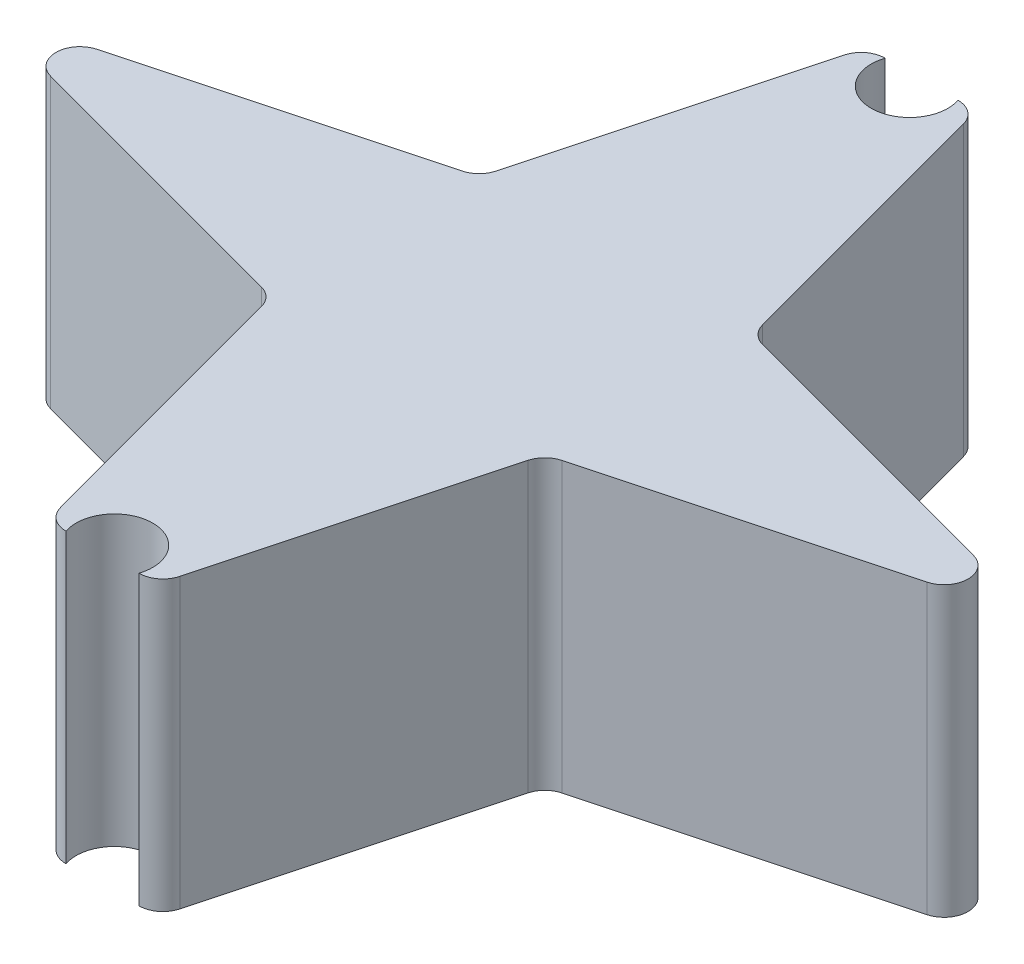
ISO-10303-21;
HEADER;
FILE_DESCRIPTION(('STEP AP214'),'2;1');
FILE_NAME('part.step','',(''),(''),'','','');
FILE_SCHEMA(('AUTOMOTIVE_DESIGN { 1 0 10303 214 1 1 1 1 }'));
ENDSEC;
DATA;
#1=APPLICATION_CONTEXT('core data for automotive mechanical design processes');
#2=APPLICATION_PROTOCOL_DEFINITION('international standard','automotive_design',2000,#1);
#3=PRODUCT_CONTEXT('',#1,'mechanical');
#4=PRODUCT('Part','Part','',(#3));
#5=PRODUCT_RELATED_PRODUCT_CATEGORY('part','',(#4));
#6=PRODUCT_DEFINITION_FORMATION('','',#4);
#7=PRODUCT_DEFINITION_CONTEXT('part definition',#1,'design');
#8=PRODUCT_DEFINITION('design','',#6,#7);
#9=PRODUCT_DEFINITION_SHAPE('','',#8);
#10=(LENGTH_UNIT() NAMED_UNIT(*) SI_UNIT(.MILLI.,.METRE.));
#11=(NAMED_UNIT(*) PLANE_ANGLE_UNIT() SI_UNIT($,.RADIAN.));
#12=(NAMED_UNIT(*) SI_UNIT($,.STERADIAN.) SOLID_ANGLE_UNIT());
#13=UNCERTAINTY_MEASURE_WITH_UNIT(LENGTH_MEASURE(1.E-05),#10,'distance_accuracy_value','');
#14=(GEOMETRIC_REPRESENTATION_CONTEXT(3) GLOBAL_UNCERTAINTY_ASSIGNED_CONTEXT((#13)) GLOBAL_UNIT_ASSIGNED_CONTEXT((#10,
#11,#12)) REPRESENTATION_CONTEXT('',''));
#15=CARTESIAN_POINT('',(0.,0.,0.));
#16=DIRECTION('',(0.,0.,1.));
#17=DIRECTION('',(1.,0.,0.));
#18=AXIS2_PLACEMENT_3D('',#15,#16,#17);
#19=CARTESIAN_POINT('',(18.,12.,0.));
#20=DIRECTION('',(0.,-1.,0.));
#21=DIRECTION('',(0.,0.,-1.));
#22=AXIS2_PLACEMENT_3D('',#19,#20,#21);
#23=CYLINDRICAL_SURFACE('',#22,1.);
#24=CARTESIAN_POINT('',(18.,0.,0.));
#25=DIRECTION('',(0.,1.,0.));
#26=DIRECTION('',(0.,0.,-1.));
#27=AXIS2_PLACEMENT_3D('',#24,#25,#26);
#28=CIRCLE('',#27,1.);
#29=CARTESIAN_POINT('',(18.2588190451025,0.,0.965925826289069));
#30=VERTEX_POINT('',#29);
#31=CARTESIAN_POINT('',(18.2588190451025,0.,-0.965925826289069));
#32=VERTEX_POINT('',#31);
#33=EDGE_CURVE('E200',#30,#32,#28,.T.);
#34=ORIENTED_EDGE('',*,*,#33,.T.);
#35=DIRECTION('',(0.,-1.,0.));
#36=VECTOR('',#35,1.);
#37=CARTESIAN_POINT('',(18.2588190451025,12.,-0.965925826289069));
#38=LINE('',#37,#36);
#39=CARTESIAN_POINT('',(18.2588190451025,12.,-0.965925826289069));
#40=VERTEX_POINT('',#39);
#41=EDGE_CURVE('E11',#40,#32,#38,.T.);
#42=ORIENTED_EDGE('',*,*,#41,.F.);
#43=CARTESIAN_POINT('',(18.,12.,0.));
#44=DIRECTION('',(0.,1.,0.));
#45=DIRECTION('',(0.,0.,-1.));
#46=AXIS2_PLACEMENT_3D('',#43,#44,#45);
#47=CIRCLE('',#46,1.);
#48=CARTESIAN_POINT('',(18.2588190451025,12.,0.965925826289069));
#49=VERTEX_POINT('',#48);
#50=EDGE_CURVE('E238',#49,#40,#47,.T.);
#51=ORIENTED_EDGE('',*,*,#50,.F.);
#52=DIRECTION('',(0.,-1.,0.));
#53=VECTOR('',#52,1.);
#54=CARTESIAN_POINT('',(18.2588190451025,12.,0.965925826289069));
#55=LINE('',#54,#53);
#56=EDGE_CURVE('E196',#49,#30,#55,.T.);
#57=ORIENTED_EDGE('',*,*,#56,.T.);
#58=EDGE_LOOP('',(#34,#42,#51,#57));
#59=FACE_BOUND('',#58,.T.);
#60=ADVANCED_FACE('F32',(#59),#23,.T.);
#61=CARTESIAN_POINT('',(6.25652833872589,12.,-4.18192992838626));
#62=DIRECTION('',(-0.258819045102521,0.,0.965925826289068));
#63=DIRECTION('',(0.965925826289068,0.,0.258819045102521));
#64=AXIS2_PLACEMENT_3D('',#61,#62,#63);
#65=PLANE('',#64);
#66=DIRECTION('',(-0.965925826289068,0.,-0.258819045102521));
#67=VECTOR('',#66,1.);
#68=CARTESIAN_POINT('',(6.25652833872589,0.,-4.18192992838626));
#69=LINE('',#68,#67);
#70=CARTESIAN_POINT('',(6.25652833872589,0.,-4.18192992838626));
#71=VERTEX_POINT('',#70);
#72=EDGE_CURVE('E203',#32,#71,#69,.T.);
#73=ORIENTED_EDGE('',*,*,#72,.T.);
#74=DIRECTION('',(0.,-1.,0.));
#75=VECTOR('',#74,1.);
#76=CARTESIAN_POINT('',(6.25652833872589,12.,-4.18192992838626));
#77=LINE('',#76,#75);
#78=CARTESIAN_POINT('',(6.25652833872589,12.,-4.18192992838626));
#79=VERTEX_POINT('',#78);
#80=EDGE_CURVE('E40',#79,#71,#77,.T.);
#81=ORIENTED_EDGE('',*,*,#80,.F.);
#82=DIRECTION('',(-0.965925826289068,0.,-0.258819045102521));
#83=VECTOR('',#82,1.);
#84=CARTESIAN_POINT('',(6.25652833872589,12.,-4.18192992838626));
#85=LINE('',#84,#83);
#86=EDGE_CURVE('E127',#40,#79,#85,.T.);
#87=ORIENTED_EDGE('',*,*,#86,.F.);
#88=ORIENTED_EDGE('',*,*,#41,.T.);
#89=EDGE_LOOP('',(#73,#81,#87,#88));
#90=FACE_BOUND('',#89,.T.);
#91=ADVANCED_FACE('F356',(#90),#65,.F.);
#92=CARTESIAN_POINT('',(6.51534738382841,12.,-5.14785575467533));
#93=DIRECTION('',(0.,-1.,0.));
#94=DIRECTION('',(0.,0.,-1.));
#95=AXIS2_PLACEMENT_3D('',#92,#93,#94);
#96=CYLINDRICAL_SURFACE('',#95,1.);
#97=CARTESIAN_POINT('',(6.51534738382841,0.,-5.14785575467533));
#98=DIRECTION('',(0.,-1.,0.));
#99=DIRECTION('',(0.,0.,1.));
#100=AXIS2_PLACEMENT_3D('',#97,#98,#99);
#101=CIRCLE('',#100,1.);
#102=CARTESIAN_POINT('',(5.54942155753934,0.,-4.88903670957281));
#103=VERTEX_POINT('',#102);
#104=EDGE_CURVE('E205',#71,#103,#101,.T.);
#105=ORIENTED_EDGE('',*,*,#104,.T.);
#106=DIRECTION('',(0.,-1.,0.));
#107=VECTOR('',#106,1.);
#108=CARTESIAN_POINT('',(5.54942155753934,12.,-4.88903670957281));
#109=LINE('',#108,#107);
#110=CARTESIAN_POINT('',(5.54942155753934,12.,-4.88903670957281));
#111=VERTEX_POINT('',#110);
#112=EDGE_CURVE('E281',#111,#103,#109,.T.);
#113=ORIENTED_EDGE('',*,*,#112,.F.);
#114=CARTESIAN_POINT('',(6.51534738382841,12.,-5.14785575467533));
#115=DIRECTION('',(0.,-1.,0.));
#116=DIRECTION('',(0.,0.,1.));
#117=AXIS2_PLACEMENT_3D('',#114,#115,#116);
#118=CIRCLE('',#117,1.);
#119=EDGE_CURVE('E289',#79,#111,#118,.T.);
#120=ORIENTED_EDGE('',*,*,#119,.F.);
#121=ORIENTED_EDGE('',*,*,#80,.T.);
#122=EDGE_LOOP('',(#105,#113,#120,#121));
#123=FACE_BOUND('',#122,.T.);
#124=ADVANCED_FACE('F287',(#123),#96,.F.);
#125=CARTESIAN_POINT('',(2.48579424164614,12.,-16.3226495079421));
#126=DIRECTION('',(-0.965925826289068,0.,0.258819045102522));
#127=DIRECTION('',(0.258819045102522,0.,0.965925826289068));
#128=AXIS2_PLACEMENT_3D('',#125,#126,#127);
#129=PLANE('',#128);
#130=DIRECTION('',(-0.258819045102522,0.,-0.965925826289068));
#131=VECTOR('',#130,1.);
#132=CARTESIAN_POINT('',(2.48579424164614,0.,-16.3226495079421));
#133=LINE('',#132,#131);
#134=CARTESIAN_POINT('',(2.48579424164614,0.,-16.3226495079421));
#135=VERTEX_POINT('',#134);
#136=EDGE_CURVE('E207',#103,#135,#133,.T.);
#137=ORIENTED_EDGE('',*,*,#136,.T.);
#138=DIRECTION('',(0.,-1.,0.));
#139=VECTOR('',#138,1.);
#140=CARTESIAN_POINT('',(2.48579424164614,12.,-16.3226495079421));
#141=LINE('',#140,#139);
#142=CARTESIAN_POINT('',(2.48579424164614,12.,-16.3226495079421));
#143=VERTEX_POINT('',#142);
#144=EDGE_CURVE('E278',#143,#135,#141,.T.);
#145=ORIENTED_EDGE('',*,*,#144,.F.);
#146=DIRECTION('',(-0.258819045102522,0.,-0.965925826289068));
#147=VECTOR('',#146,1.);
#148=CARTESIAN_POINT('',(2.48579424164614,12.,-16.3226495079421));
#149=LINE('',#148,#147);
#150=EDGE_CURVE('E307',#111,#143,#149,.T.);
#151=ORIENTED_EDGE('',*,*,#150,.F.);
#152=ORIENTED_EDGE('',*,*,#112,.T.);
#153=EDGE_LOOP('',(#137,#145,#151,#152));
#154=FACE_BOUND('',#153,.T.);
#155=ADVANCED_FACE('F298',(#154),#129,.F.);
#156=CARTESIAN_POINT('',(1.51986841535707,12.,-16.0638304628395));
#157=DIRECTION('',(0.,-1.,0.));
#158=DIRECTION('',(0.,0.,-1.));
#159=AXIS2_PLACEMENT_3D('',#156,#157,#158);
#160=CYLINDRICAL_SURFACE('',#159,1.);
#161=CARTESIAN_POINT('',(1.51986841535707,0.,-16.0638304628395));
#162=DIRECTION('',(0.,1.,0.));
#163=DIRECTION('',(0.,0.,1.));
#164=AXIS2_PLACEMENT_3D('',#161,#162,#163);
#165=CIRCLE('',#164,1.);
#166=CARTESIAN_POINT('',(1.51986841535707,0.,-17.0638304628396));
#167=VERTEX_POINT('',#166);
#168=EDGE_CURVE('E209',#135,#167,#165,.T.);
#169=ORIENTED_EDGE('',*,*,#168,.T.);
#170=DIRECTION('',(0.,-1.,0.));
#171=VECTOR('',#170,1.);
#172=CARTESIAN_POINT('',(1.51986841535707,12.,-17.0638304628396));
#173=LINE('',#172,#171);
#174=CARTESIAN_POINT('',(1.51986841535707,12.,-17.0638304628396));
#175=VERTEX_POINT('',#174);
#176=EDGE_CURVE('E275',#175,#167,#173,.T.);
#177=ORIENTED_EDGE('',*,*,#176,.F.);
#178=CARTESIAN_POINT('',(1.51986841535707,12.,-16.0638304628395));
#179=DIRECTION('',(0.,1.,0.));
#180=DIRECTION('',(0.,0.,1.));
#181=AXIS2_PLACEMENT_3D('',#178,#179,#180);
#182=CIRCLE('',#181,1.);
#183=EDGE_CURVE('E304',#143,#175,#182,.T.);
#184=ORIENTED_EDGE('',*,*,#183,.F.);
#185=ORIENTED_EDGE('',*,*,#144,.T.);
#186=EDGE_LOOP('',(#169,#177,#184,#185));
#187=FACE_BOUND('',#186,.T.);
#188=ADVANCED_FACE('F302',(#187),#160,.T.);
#189=CARTESIAN_POINT('',(0.,12.,-16.5638304628396));
#190=DIRECTION('',(0.,-1.,0.));
#191=DIRECTION('',(0.,0.,-1.));
#192=AXIS2_PLACEMENT_3D('',#189,#190,#191);
#193=CYLINDRICAL_SURFACE('',#192,1.60000000000001);
#194=CARTESIAN_POINT('',(0.,0.,-16.5638304628396));
#195=DIRECTION('',(0.,-1.,0.));
#196=DIRECTION('',(0.,0.,1.));
#197=AXIS2_PLACEMENT_3D('',#194,#195,#196);
#198=CIRCLE('',#197,1.60000000000001);
#199=CARTESIAN_POINT('',(-1.51986841535709,0.,-17.0638304628396));
#200=VERTEX_POINT('',#199);
#201=EDGE_CURVE('E211',#167,#200,#198,.T.);
#202=ORIENTED_EDGE('',*,*,#201,.T.);
#203=DIRECTION('',(0.,-1.,0.));
#204=VECTOR('',#203,1.);
#205=CARTESIAN_POINT('',(-1.51986841535709,12.,-17.0638304628396));
#206=LINE('',#205,#204);
#207=CARTESIAN_POINT('',(-1.51986841535709,12.,-17.0638304628396));
#208=VERTEX_POINT('',#207);
#209=EDGE_CURVE('E272',#208,#200,#206,.T.);
#210=ORIENTED_EDGE('',*,*,#209,.F.);
#211=CARTESIAN_POINT('',(0.,12.,-16.5638304628396));
#212=DIRECTION('',(0.,-1.,0.));
#213=DIRECTION('',(0.,0.,1.));
#214=AXIS2_PLACEMENT_3D('',#211,#212,#213);
#215=CIRCLE('',#214,1.60000000000001);
#216=EDGE_CURVE('E306',#175,#208,#215,.T.);
#217=ORIENTED_EDGE('',*,*,#216,.F.);
#218=ORIENTED_EDGE('',*,*,#176,.T.);
#219=EDGE_LOOP('',(#202,#210,#217,#218));
#220=FACE_BOUND('',#219,.T.);
#221=ADVANCED_FACE('F369',(#220),#193,.F.);
#222=CARTESIAN_POINT('',(-1.51986841535707,12.,-16.0638304628395));
#223=DIRECTION('',(0.,-1.,0.));
#224=DIRECTION('',(0.,0.,-1.));
#225=AXIS2_PLACEMENT_3D('',#222,#223,#224);
#226=CYLINDRICAL_SURFACE('',#225,1.);
#227=CARTESIAN_POINT('',(-1.51986841535707,0.,-16.0638304628395));
#228=DIRECTION('',(0.,1.,0.));
#229=DIRECTION('',(0.,0.,-1.));
#230=AXIS2_PLACEMENT_3D('',#227,#228,#229);
#231=CIRCLE('',#230,1.);
#232=CARTESIAN_POINT('',(-2.48579424164614,0.,-16.3226495079421));
#233=VERTEX_POINT('',#232);
#234=EDGE_CURVE('E213',#200,#233,#231,.T.);
#235=ORIENTED_EDGE('',*,*,#234,.T.);
#236=DIRECTION('',(0.,-1.,0.));
#237=VECTOR('',#236,1.);
#238=CARTESIAN_POINT('',(-2.48579424164614,12.,-16.3226495079421));
#239=LINE('',#238,#237);
#240=CARTESIAN_POINT('',(-2.48579424164614,12.,-16.3226495079421));
#241=VERTEX_POINT('',#240);
#242=EDGE_CURVE('E269',#241,#233,#239,.T.);
#243=ORIENTED_EDGE('',*,*,#242,.F.);
#244=CARTESIAN_POINT('',(-1.51986841535707,12.,-16.0638304628395));
#245=DIRECTION('',(0.,1.,0.));
#246=DIRECTION('',(0.,0.,-1.));
#247=AXIS2_PLACEMENT_3D('',#244,#245,#246);
#248=CIRCLE('',#247,1.);
#249=EDGE_CURVE('E309',#208,#241,#248,.T.);
#250=ORIENTED_EDGE('',*,*,#249,.F.);
#251=ORIENTED_EDGE('',*,*,#209,.T.);
#252=EDGE_LOOP('',(#235,#243,#250,#251));
#253=FACE_BOUND('',#252,.T.);
#254=ADVANCED_FACE('F372',(#253),#226,.T.);
#255=CARTESIAN_POINT('',(-2.48579424164614,12.,-16.3226495079421));
#256=DIRECTION('',(0.965925826289068,0.,0.258819045102521));
#257=DIRECTION('',(0.258819045102521,0.,-0.965925826289068));
#258=AXIS2_PLACEMENT_3D('',#255,#256,#257);
#259=PLANE('',#258);
#260=DIRECTION('',(-0.258819045102521,0.,0.965925826289068));
#261=VECTOR('',#260,1.);
#262=CARTESIAN_POINT('',(-2.48579424164614,0.,-16.3226495079421));
#263=LINE('',#262,#261);
#264=CARTESIAN_POINT('',(-5.54942155753934,0.,-4.88903670957281));
#265=VERTEX_POINT('',#264);
#266=EDGE_CURVE('E215',#233,#265,#263,.T.);
#267=ORIENTED_EDGE('',*,*,#266,.T.);
#268=DIRECTION('',(0.,-1.,0.));
#269=VECTOR('',#268,1.);
#270=CARTESIAN_POINT('',(-5.54942155753934,12.,-4.88903670957281));
#271=LINE('',#270,#269);
#272=CARTESIAN_POINT('',(-5.54942155753934,12.,-4.88903670957281));
#273=VERTEX_POINT('',#272);
#274=EDGE_CURVE('E266',#273,#265,#271,.T.);
#275=ORIENTED_EDGE('',*,*,#274,.F.);
#276=DIRECTION('',(-0.258819045102521,0.,0.965925826289068));
#277=VECTOR('',#276,1.);
#278=CARTESIAN_POINT('',(-2.48579424164614,12.,-16.3226495079421));
#279=LINE('',#278,#277);
#280=EDGE_CURVE('E315',#241,#273,#279,.T.);
#281=ORIENTED_EDGE('',*,*,#280,.F.);
#282=ORIENTED_EDGE('',*,*,#242,.T.);
#283=EDGE_LOOP('',(#267,#275,#281,#282));
#284=FACE_BOUND('',#283,.T.);
#285=ADVANCED_FACE('F376',(#284),#259,.F.);
#286=CARTESIAN_POINT('',(-6.51534738382841,12.,-5.14785575467533));
#287=DIRECTION('',(0.,-1.,0.));
#288=DIRECTION('',(0.,0.,-1.));
#289=AXIS2_PLACEMENT_3D('',#286,#287,#288);
#290=CYLINDRICAL_SURFACE('',#289,1.);
#291=CARTESIAN_POINT('',(-6.51534738382841,0.,-5.14785575467533));
#292=DIRECTION('',(0.,-1.,0.));
#293=DIRECTION('',(0.,0.,-1.));
#294=AXIS2_PLACEMENT_3D('',#291,#292,#293);
#295=CIRCLE('',#294,1.);
#296=CARTESIAN_POINT('',(-6.25652833872589,0.,-4.18192992838626));
#297=VERTEX_POINT('',#296);
#298=EDGE_CURVE('E217',#265,#297,#295,.T.);
#299=ORIENTED_EDGE('',*,*,#298,.T.);
#300=DIRECTION('',(0.,-1.,0.));
#301=VECTOR('',#300,1.);
#302=CARTESIAN_POINT('',(-6.25652833872589,12.,-4.18192992838626));
#303=LINE('',#302,#301);
#304=CARTESIAN_POINT('',(-6.25652833872589,12.,-4.18192992838626));
#305=VERTEX_POINT('',#304);
#306=EDGE_CURVE('E263',#305,#297,#303,.T.);
#307=ORIENTED_EDGE('',*,*,#306,.F.);
#308=CARTESIAN_POINT('',(-6.51534738382841,12.,-5.14785575467533));
#309=DIRECTION('',(0.,-1.,0.));
#310=DIRECTION('',(0.,0.,-1.));
#311=AXIS2_PLACEMENT_3D('',#308,#309,#310);
#312=CIRCLE('',#311,1.);
#313=EDGE_CURVE('E317',#273,#305,#312,.T.);
#314=ORIENTED_EDGE('',*,*,#313,.F.);
#315=ORIENTED_EDGE('',*,*,#274,.T.);
#316=EDGE_LOOP('',(#299,#307,#314,#315));
#317=FACE_BOUND('',#316,.T.);
#318=ADVANCED_FACE('F380',(#317),#290,.F.);
#319=CARTESIAN_POINT('',(-6.25652833872589,12.,-4.18192992838626));
#320=DIRECTION('',(0.258819045102522,0.,0.965925826289068));
#321=DIRECTION('',(0.965925826289068,0.,-0.258819045102522));
#322=AXIS2_PLACEMENT_3D('',#319,#320,#321);
#323=PLANE('',#322);
#324=DIRECTION('',(-0.965925826289068,0.,0.258819045102522));
#325=VECTOR('',#324,1.);
#326=CARTESIAN_POINT('',(-6.25652833872589,0.,-4.18192992838626));
#327=LINE('',#326,#325);
#328=CARTESIAN_POINT('',(-18.2588190451025,0.,-0.965925826289065));
#329=VERTEX_POINT('',#328);
#330=EDGE_CURVE('E219',#297,#329,#327,.T.);
#331=ORIENTED_EDGE('',*,*,#330,.T.);
#332=DIRECTION('',(0.,-1.,0.));
#333=VECTOR('',#332,1.);
#334=CARTESIAN_POINT('',(-18.2588190451025,12.,-0.965925826289065));
#335=LINE('',#334,#333);
#336=CARTESIAN_POINT('',(-18.2588190451025,12.,-0.965925826289065));
#337=VERTEX_POINT('',#336);
#338=EDGE_CURVE('E260',#337,#329,#335,.T.);
#339=ORIENTED_EDGE('',*,*,#338,.F.);
#340=DIRECTION('',(-0.965925826289068,0.,0.258819045102522));
#341=VECTOR('',#340,1.);
#342=CARTESIAN_POINT('',(-6.25652833872589,12.,-4.18192992838626));
#343=LINE('',#342,#341);
#344=EDGE_CURVE('E319',#305,#337,#343,.T.);
#345=ORIENTED_EDGE('',*,*,#344,.F.);
#346=ORIENTED_EDGE('',*,*,#306,.T.);
#347=EDGE_LOOP('',(#331,#339,#345,#346));
#348=FACE_BOUND('',#347,.T.);
#349=ADVANCED_FACE('F384',(#348),#323,.F.);
#350=CARTESIAN_POINT('',(-18.,12.,0.));
#351=DIRECTION('',(0.,-1.,0.));
#352=DIRECTION('',(0.,0.,-1.));
#353=AXIS2_PLACEMENT_3D('',#350,#351,#352);
#354=CYLINDRICAL_SURFACE('',#353,0.999999999999997);
#355=CARTESIAN_POINT('',(-18.,0.,0.));
#356=DIRECTION('',(0.,1.,0.));
#357=DIRECTION('',(0.,0.,1.));
#358=AXIS2_PLACEMENT_3D('',#355,#356,#357);
#359=CIRCLE('',#358,0.999999999999997);
#360=CARTESIAN_POINT('',(-18.2588190451025,0.,0.965925826289069));
#361=VERTEX_POINT('',#360);
#362=EDGE_CURVE('E221',#329,#361,#359,.T.);
#363=ORIENTED_EDGE('',*,*,#362,.T.);
#364=DIRECTION('',(0.,-1.,0.));
#365=VECTOR('',#364,1.);
#366=CARTESIAN_POINT('',(-18.2588190451025,12.,0.965925826289069));
#367=LINE('',#366,#365);
#368=CARTESIAN_POINT('',(-18.2588190451025,12.,0.965925826289069));
#369=VERTEX_POINT('',#368);
#370=EDGE_CURVE('E257',#369,#361,#367,.T.);
#371=ORIENTED_EDGE('',*,*,#370,.F.);
#372=CARTESIAN_POINT('',(-18.,12.,0.));
#373=DIRECTION('',(0.,1.,0.));
#374=DIRECTION('',(0.,0.,1.));
#375=AXIS2_PLACEMENT_3D('',#372,#373,#374);
#376=CIRCLE('',#375,0.999999999999997);
#377=EDGE_CURVE('E321',#337,#369,#376,.T.);
#378=ORIENTED_EDGE('',*,*,#377,.F.);
#379=ORIENTED_EDGE('',*,*,#338,.T.);
#380=EDGE_LOOP('',(#363,#371,#378,#379));
#381=FACE_BOUND('',#380,.T.);
#382=ADVANCED_FACE('F388',(#381),#354,.T.);
#383=CARTESIAN_POINT('',(-6.25652833872589,12.,4.18192992838626));
#384=DIRECTION('',(0.258819045102522,0.,-0.965925826289068));
#385=DIRECTION('',(-0.965925826289068,0.,-0.258819045102522));
#386=AXIS2_PLACEMENT_3D('',#383,#384,#385);
#387=PLANE('',#386);
#388=DIRECTION('',(0.965925826289068,0.,0.258819045102522));
#389=VECTOR('',#388,1.);
#390=CARTESIAN_POINT('',(-6.25652833872589,0.,4.18192992838626));
#391=LINE('',#390,#389);
#392=CARTESIAN_POINT('',(-6.25652833872589,0.,4.18192992838626));
#393=VERTEX_POINT('',#392);
#394=EDGE_CURVE('E223',#361,#393,#391,.T.);
#395=ORIENTED_EDGE('',*,*,#394,.T.);
#396=DIRECTION('',(0.,-1.,0.));
#397=VECTOR('',#396,1.);
#398=CARTESIAN_POINT('',(-6.25652833872589,12.,4.18192992838626));
#399=LINE('',#398,#397);
#400=CARTESIAN_POINT('',(-6.25652833872589,12.,4.18192992838626));
#401=VERTEX_POINT('',#400);
#402=EDGE_CURVE('E254',#401,#393,#399,.T.);
#403=ORIENTED_EDGE('',*,*,#402,.F.);
#404=DIRECTION('',(0.965925826289068,0.,0.258819045102522));
#405=VECTOR('',#404,1.);
#406=CARTESIAN_POINT('',(-6.25652833872589,12.,4.18192992838626));
#407=LINE('',#406,#405);
#408=EDGE_CURVE('E323',#369,#401,#407,.T.);
#409=ORIENTED_EDGE('',*,*,#408,.F.);
#410=ORIENTED_EDGE('',*,*,#370,.T.);
#411=EDGE_LOOP('',(#395,#403,#409,#410));
#412=FACE_BOUND('',#411,.T.);
#413=ADVANCED_FACE('F392',(#412),#387,.F.);
#414=CARTESIAN_POINT('',(-6.51534738382841,12.,5.14785575467534));
#415=DIRECTION('',(0.,-1.,0.));
#416=DIRECTION('',(0.,0.,-1.));
#417=AXIS2_PLACEMENT_3D('',#414,#415,#416);
#418=CYLINDRICAL_SURFACE('',#417,1.);
#419=CARTESIAN_POINT('',(-6.51534738382841,0.,5.14785575467534));
#420=DIRECTION('',(0.,-1.,0.));
#421=DIRECTION('',(0.,0.,1.));
#422=AXIS2_PLACEMENT_3D('',#419,#420,#421);
#423=CIRCLE('',#422,1.);
#424=CARTESIAN_POINT('',(-5.54942155753934,0.,4.88903670957281));
#425=VERTEX_POINT('',#424);
#426=EDGE_CURVE('E225',#393,#425,#423,.T.);
#427=ORIENTED_EDGE('',*,*,#426,.T.);
#428=DIRECTION('',(0.,-1.,0.));
#429=VECTOR('',#428,1.);
#430=CARTESIAN_POINT('',(-5.54942155753934,12.,4.88903670957281));
#431=LINE('',#430,#429);
#432=CARTESIAN_POINT('',(-5.54942155753934,12.,4.88903670957281));
#433=VERTEX_POINT('',#432);
#434=EDGE_CURVE('E251',#433,#425,#431,.T.);
#435=ORIENTED_EDGE('',*,*,#434,.F.);
#436=CARTESIAN_POINT('',(-6.51534738382841,12.,5.14785575467534));
#437=DIRECTION('',(0.,-1.,0.));
#438=DIRECTION('',(0.,0.,1.));
#439=AXIS2_PLACEMENT_3D('',#436,#437,#438);
#440=CIRCLE('',#439,1.);
#441=EDGE_CURVE('E325',#401,#433,#440,.T.);
#442=ORIENTED_EDGE('',*,*,#441,.F.);
#443=ORIENTED_EDGE('',*,*,#402,.T.);
#444=EDGE_LOOP('',(#427,#435,#442,#443));
#445=FACE_BOUND('',#444,.T.);
#446=ADVANCED_FACE('F396',(#445),#418,.F.);
#447=CARTESIAN_POINT('',(-2.48579424164614,12.,16.3226495079421));
#448=DIRECTION('',(0.965925826289068,0.,-0.258819045102521));
#449=DIRECTION('',(-0.258819045102521,0.,-0.965925826289068));
#450=AXIS2_PLACEMENT_3D('',#447,#448,#449);
#451=PLANE('',#450);
#452=DIRECTION('',(0.258819045102521,0.,0.965925826289068));
#453=VECTOR('',#452,1.);
#454=CARTESIAN_POINT('',(-2.48579424164614,0.,16.3226495079421));
#455=LINE('',#454,#453);
#456=CARTESIAN_POINT('',(-2.48579424164614,0.,16.3226495079421));
#457=VERTEX_POINT('',#456);
#458=EDGE_CURVE('E227',#425,#457,#455,.T.);
#459=ORIENTED_EDGE('',*,*,#458,.T.);
#460=DIRECTION('',(0.,-1.,0.));
#461=VECTOR('',#460,1.);
#462=CARTESIAN_POINT('',(-2.48579424164614,12.,16.3226495079421));
#463=LINE('',#462,#461);
#464=CARTESIAN_POINT('',(-2.48579424164614,12.,16.3226495079421));
#465=VERTEX_POINT('',#464);
#466=EDGE_CURVE('E248',#465,#457,#463,.T.);
#467=ORIENTED_EDGE('',*,*,#466,.F.);
#468=DIRECTION('',(0.258819045102521,0.,0.965925826289068));
#469=VECTOR('',#468,1.);
#470=CARTESIAN_POINT('',(-2.48579424164614,12.,16.3226495079421));
#471=LINE('',#470,#469);
#472=EDGE_CURVE('E327',#433,#465,#471,.T.);
#473=ORIENTED_EDGE('',*,*,#472,.F.);
#474=ORIENTED_EDGE('',*,*,#434,.T.);
#475=EDGE_LOOP('',(#459,#467,#473,#474));
#476=FACE_BOUND('',#475,.T.);
#477=ADVANCED_FACE('F400',(#476),#451,.F.);
#478=CARTESIAN_POINT('',(-1.51986841535706,12.,16.0638304628395));
#479=DIRECTION('',(0.,-1.,0.));
#480=DIRECTION('',(0.,0.,-1.));
#481=AXIS2_PLACEMENT_3D('',#478,#479,#480);
#482=CYLINDRICAL_SURFACE('',#481,1.);
#483=CARTESIAN_POINT('',(-1.51986841535706,0.,16.0638304628395));
#484=DIRECTION('',(0.,1.,0.));
#485=DIRECTION('',(0.,0.,1.));
#486=AXIS2_PLACEMENT_3D('',#483,#484,#485);
#487=CIRCLE('',#486,1.);
#488=CARTESIAN_POINT('',(-1.51986841535706,0.,17.0638304628396));
#489=VERTEX_POINT('',#488);
#490=EDGE_CURVE('E229',#457,#489,#487,.T.);
#491=ORIENTED_EDGE('',*,*,#490,.T.);
#492=DIRECTION('',(0.,-1.,0.));
#493=VECTOR('',#492,1.);
#494=CARTESIAN_POINT('',(-1.51986841535706,12.,17.0638304628396));
#495=LINE('',#494,#493);
#496=CARTESIAN_POINT('',(-1.51986841535706,12.,17.0638304628396));
#497=VERTEX_POINT('',#496);
#498=EDGE_CURVE('E245',#497,#489,#495,.T.);
#499=ORIENTED_EDGE('',*,*,#498,.F.);
#500=CARTESIAN_POINT('',(-1.51986841535706,12.,16.0638304628395));
#501=DIRECTION('',(0.,1.,0.));
#502=DIRECTION('',(0.,0.,1.));
#503=AXIS2_PLACEMENT_3D('',#500,#501,#502);
#504=CIRCLE('',#503,1.);
#505=EDGE_CURVE('E329',#465,#497,#504,.T.);
#506=ORIENTED_EDGE('',*,*,#505,.F.);
#507=ORIENTED_EDGE('',*,*,#466,.T.);
#508=EDGE_LOOP('',(#491,#499,#506,#507));
#509=FACE_BOUND('',#508,.T.);
#510=ADVANCED_FACE('F404',(#509),#482,.T.);
#511=CARTESIAN_POINT('',(0.,12.,16.5638304628396));
#512=DIRECTION('',(0.,-1.,0.));
#513=DIRECTION('',(0.,0.,-1.));
#514=AXIS2_PLACEMENT_3D('',#511,#512,#513);
#515=CYLINDRICAL_SURFACE('',#514,1.60000000000001);
#516=CARTESIAN_POINT('',(0.,0.,16.5638304628396));
#517=DIRECTION('',(0.,-1.,0.));
#518=DIRECTION('',(0.,0.,-1.));
#519=AXIS2_PLACEMENT_3D('',#516,#517,#518);
#520=CIRCLE('',#519,1.60000000000001);
#521=CARTESIAN_POINT('',(1.51986841535706,0.,17.0638304628395));
#522=VERTEX_POINT('',#521);
#523=EDGE_CURVE('E231',#489,#522,#520,.T.);
#524=ORIENTED_EDGE('',*,*,#523,.T.);
#525=DIRECTION('',(0.,-1.,0.));
#526=VECTOR('',#525,1.);
#527=CARTESIAN_POINT('',(1.51986841535706,12.,17.0638304628395));
#528=LINE('',#527,#526);
#529=CARTESIAN_POINT('',(1.51986841535706,12.,17.0638304628395));
#530=VERTEX_POINT('',#529);
#531=EDGE_CURVE('E242',#530,#522,#528,.T.);
#532=ORIENTED_EDGE('',*,*,#531,.F.);
#533=CARTESIAN_POINT('',(0.,12.,16.5638304628396));
#534=DIRECTION('',(0.,-1.,0.));
#535=DIRECTION('',(0.,0.,-1.));
#536=AXIS2_PLACEMENT_3D('',#533,#534,#535);
#537=CIRCLE('',#536,1.60000000000001);
#538=EDGE_CURVE('E331',#497,#530,#537,.T.);
#539=ORIENTED_EDGE('',*,*,#538,.F.);
#540=ORIENTED_EDGE('',*,*,#498,.T.);
#541=EDGE_LOOP('',(#524,#532,#539,#540));
#542=FACE_BOUND('',#541,.T.);
#543=ADVANCED_FACE('F337',(#542),#515,.F.);
#544=CARTESIAN_POINT('',(1.51986841535707,12.,16.0638304628395));
#545=DIRECTION('',(0.,-1.,0.));
#546=DIRECTION('',(0.,0.,-1.));
#547=AXIS2_PLACEMENT_3D('',#544,#545,#546);
#548=CYLINDRICAL_SURFACE('',#547,1.);
#549=CARTESIAN_POINT('',(1.51986841535707,0.,16.0638304628395));
#550=DIRECTION('',(0.,1.,0.));
#551=DIRECTION('',(0.,0.,-1.));
#552=AXIS2_PLACEMENT_3D('',#549,#550,#551);
#553=CIRCLE('',#552,1.);
#554=CARTESIAN_POINT('',(2.48579424164614,0.,16.3226495079421));
#555=VERTEX_POINT('',#554);
#556=EDGE_CURVE('E233',#522,#555,#553,.T.);
#557=ORIENTED_EDGE('',*,*,#556,.T.);
#558=DIRECTION('',(0.,-1.,0.));
#559=VECTOR('',#558,1.);
#560=CARTESIAN_POINT('',(2.48579424164614,12.,16.3226495079421));
#561=LINE('',#560,#559);
#562=CARTESIAN_POINT('',(2.48579424164614,12.,16.3226495079421));
#563=VERTEX_POINT('',#562);
#564=EDGE_CURVE('E191',#563,#555,#561,.T.);
#565=ORIENTED_EDGE('',*,*,#564,.F.);
#566=CARTESIAN_POINT('',(1.51986841535707,12.,16.0638304628395));
#567=DIRECTION('',(0.,1.,0.));
#568=DIRECTION('',(0.,0.,-1.));
#569=AXIS2_PLACEMENT_3D('',#566,#567,#568);
#570=CIRCLE('',#569,1.);
#571=EDGE_CURVE('E182',#530,#563,#570,.T.);
#572=ORIENTED_EDGE('',*,*,#571,.F.);
#573=ORIENTED_EDGE('',*,*,#531,.T.);
#574=EDGE_LOOP('',(#557,#565,#572,#573));
#575=FACE_BOUND('',#574,.T.);
#576=ADVANCED_FACE('F341',(#575),#548,.T.);
#577=CARTESIAN_POINT('',(2.48579424164614,12.,16.3226495079421));
#578=DIRECTION('',(-0.965925826289068,0.,-0.258819045102522));
#579=DIRECTION('',(-0.258819045102522,0.,0.965925826289068));
#580=AXIS2_PLACEMENT_3D('',#577,#578,#579);
#581=PLANE('',#580);
#582=DIRECTION('',(0.258819045102522,0.,-0.965925826289068));
#583=VECTOR('',#582,1.);
#584=CARTESIAN_POINT('',(2.48579424164614,0.,16.3226495079421));
#585=LINE('',#584,#583);
#586=CARTESIAN_POINT('',(5.54942155753934,0.,4.88903670957281));
#587=VERTEX_POINT('',#586);
#588=EDGE_CURVE('E190',#555,#587,#585,.T.);
#589=ORIENTED_EDGE('',*,*,#588,.T.);
#590=DIRECTION('',(0.,-1.,0.));
#591=VECTOR('',#590,1.);
#592=CARTESIAN_POINT('',(5.54942155753934,12.,4.88903670957281));
#593=LINE('',#592,#591);
#594=CARTESIAN_POINT('',(5.54942155753934,12.,4.88903670957281));
#595=VERTEX_POINT('',#594);
#596=EDGE_CURVE('E187',#595,#587,#593,.T.);
#597=ORIENTED_EDGE('',*,*,#596,.F.);
#598=DIRECTION('',(0.258819045102522,0.,-0.965925826289068));
#599=VECTOR('',#598,1.);
#600=CARTESIAN_POINT('',(2.48579424164614,12.,16.3226495079421));
#601=LINE('',#600,#599);
#602=EDGE_CURVE('E176',#563,#595,#601,.T.);
#603=ORIENTED_EDGE('',*,*,#602,.F.);
#604=ORIENTED_EDGE('',*,*,#564,.T.);
#605=EDGE_LOOP('',(#589,#597,#603,#604));
#606=FACE_BOUND('',#605,.T.);
#607=ADVANCED_FACE('F188',(#606),#581,.F.);
#608=CARTESIAN_POINT('',(6.51534738382841,12.,5.14785575467533));
#609=DIRECTION('',(0.,-1.,0.));
#610=DIRECTION('',(0.,0.,-1.));
#611=AXIS2_PLACEMENT_3D('',#608,#609,#610);
#612=CYLINDRICAL_SURFACE('',#611,1.);
#613=CARTESIAN_POINT('',(6.51534738382841,0.,5.14785575467533));
#614=DIRECTION('',(0.,-1.,0.));
#615=DIRECTION('',(0.,0.,-1.));
#616=AXIS2_PLACEMENT_3D('',#613,#614,#615);
#617=CIRCLE('',#616,1.);
#618=CARTESIAN_POINT('',(6.25652833872589,0.,4.18192992838626));
#619=VERTEX_POINT('',#618);
#620=EDGE_CURVE('E113',#587,#619,#617,.T.);
#621=ORIENTED_EDGE('',*,*,#620,.T.);
#622=DIRECTION('',(0.,-1.,0.));
#623=VECTOR('',#622,1.);
#624=CARTESIAN_POINT('',(6.25652833872589,12.,4.18192992838626));
#625=LINE('',#624,#623);
#626=CARTESIAN_POINT('',(6.25652833872589,12.,4.18192992838626));
#627=VERTEX_POINT('',#626);
#628=EDGE_CURVE('E192',#627,#619,#625,.T.);
#629=ORIENTED_EDGE('',*,*,#628,.F.);
#630=CARTESIAN_POINT('',(6.51534738382841,12.,5.14785575467533));
#631=DIRECTION('',(0.,-1.,0.));
#632=DIRECTION('',(0.,0.,-1.));
#633=AXIS2_PLACEMENT_3D('',#630,#631,#632);
#634=CIRCLE('',#633,1.);
#635=EDGE_CURVE('E180',#595,#627,#634,.T.);
#636=ORIENTED_EDGE('',*,*,#635,.F.);
#637=ORIENTED_EDGE('',*,*,#596,.T.);
#638=EDGE_LOOP('',(#621,#629,#636,#637));
#639=FACE_BOUND('',#638,.T.);
#640=ADVANCED_FACE('F194',(#639),#612,.F.);
#641=CARTESIAN_POINT('',(6.25652833872589,12.,4.18192992838626));
#642=DIRECTION('',(-0.258819045102521,0.,-0.965925826289068));
#643=DIRECTION('',(-0.965925826289068,0.,0.258819045102521));
#644=AXIS2_PLACEMENT_3D('',#641,#642,#643);
#645=PLANE('',#644);
#646=DIRECTION('',(0.965925826289068,0.,-0.258819045102521));
#647=VECTOR('',#646,1.);
#648=CARTESIAN_POINT('',(6.25652833872589,0.,4.18192992838626));
#649=LINE('',#648,#647);
#650=EDGE_CURVE('E119',#619,#30,#649,.T.);
#651=ORIENTED_EDGE('',*,*,#650,.T.);
#652=ORIENTED_EDGE('',*,*,#56,.F.);
#653=DIRECTION('',(0.965925826289068,0.,-0.258819045102521));
#654=VECTOR('',#653,1.);
#655=CARTESIAN_POINT('',(6.25652833872589,12.,4.18192992838626));
#656=LINE('',#655,#654);
#657=EDGE_CURVE('E48',#627,#49,#656,.T.);
#658=ORIENTED_EDGE('',*,*,#657,.F.);
#659=ORIENTED_EDGE('',*,*,#628,.T.);
#660=EDGE_LOOP('',(#651,#652,#658,#659));
#661=FACE_BOUND('',#660,.T.);
#662=ADVANCED_FACE('F345',(#661),#645,.F.);
#663=CARTESIAN_POINT('',(18.,12.,0.));
#664=DIRECTION('',(0.,-1.,0.));
#665=DIRECTION('',(0.,0.,-1.));
#666=AXIS2_PLACEMENT_3D('',#663,#664,#665);
#667=PLANE('',#666);
#668=ORIENTED_EDGE('',*,*,#50,.T.);
#669=ORIENTED_EDGE('',*,*,#86,.T.);
#670=ORIENTED_EDGE('',*,*,#119,.T.);
#671=ORIENTED_EDGE('',*,*,#150,.T.);
#672=ORIENTED_EDGE('',*,*,#183,.T.);
#673=ORIENTED_EDGE('',*,*,#216,.T.);
#674=ORIENTED_EDGE('',*,*,#249,.T.);
#675=ORIENTED_EDGE('',*,*,#280,.T.);
#676=ORIENTED_EDGE('',*,*,#313,.T.);
#677=ORIENTED_EDGE('',*,*,#344,.T.);
#678=ORIENTED_EDGE('',*,*,#377,.T.);
#679=ORIENTED_EDGE('',*,*,#408,.T.);
#680=ORIENTED_EDGE('',*,*,#441,.T.);
#681=ORIENTED_EDGE('',*,*,#472,.T.);
#682=ORIENTED_EDGE('',*,*,#505,.T.);
#683=ORIENTED_EDGE('',*,*,#538,.T.);
#684=ORIENTED_EDGE('',*,*,#571,.T.);
#685=ORIENTED_EDGE('',*,*,#602,.T.);
#686=ORIENTED_EDGE('',*,*,#635,.T.);
#687=ORIENTED_EDGE('',*,*,#657,.T.);
#688=EDGE_LOOP('',(#668,#669,#670,#671,#672,#673,#674,#675,#676,#677,#678,#679,#680,#681,#682,
#683,#684,#685,#686,#687));
#689=FACE_BOUND('',#688,.T.);
#690=ADVANCED_FACE('F178',(#689),#667,.F.);
#691=CARTESIAN_POINT('',(18.,0.,0.));
#692=DIRECTION('',(0.,-1.,0.));
#693=DIRECTION('',(0.,0.,-1.));
#694=AXIS2_PLACEMENT_3D('',#691,#692,#693);
#695=PLANE('',#694);
#696=ORIENTED_EDGE('',*,*,#33,.F.);
#697=ORIENTED_EDGE('',*,*,#650,.F.);
#698=ORIENTED_EDGE('',*,*,#620,.F.);
#699=ORIENTED_EDGE('',*,*,#588,.F.);
#700=ORIENTED_EDGE('',*,*,#556,.F.);
#701=ORIENTED_EDGE('',*,*,#523,.F.);
#702=ORIENTED_EDGE('',*,*,#490,.F.);
#703=ORIENTED_EDGE('',*,*,#458,.F.);
#704=ORIENTED_EDGE('',*,*,#426,.F.);
#705=ORIENTED_EDGE('',*,*,#394,.F.);
#706=ORIENTED_EDGE('',*,*,#362,.F.);
#707=ORIENTED_EDGE('',*,*,#330,.F.);
#708=ORIENTED_EDGE('',*,*,#298,.F.);
#709=ORIENTED_EDGE('',*,*,#266,.F.);
#710=ORIENTED_EDGE('',*,*,#234,.F.);
#711=ORIENTED_EDGE('',*,*,#201,.F.);
#712=ORIENTED_EDGE('',*,*,#168,.F.);
#713=ORIENTED_EDGE('',*,*,#136,.F.);
#714=ORIENTED_EDGE('',*,*,#104,.F.);
#715=ORIENTED_EDGE('',*,*,#72,.F.);
#716=EDGE_LOOP('',(#696,#697,#698,#699,#700,#701,#702,#703,#704,#705,#706,#707,#708,#709,#710,
#711,#712,#713,#714,#715));
#717=FACE_BOUND('',#716,.T.);
#718=ADVANCED_FACE('F293',(#717),#695,.T.);
#719=CLOSED_SHELL('',(#60,#91,#124,#155,#188,#221,#254,#285,#318,#349,#382,#413,#446,#477,#510,
#543,#576,#607,#640,#662,#690,#718));
#720=MANIFOLD_SOLID_BREP('B2',#719);
#721=ADVANCED_BREP_SHAPE_REPRESENTATION('',(#18,#720),#14);
#722=SHAPE_DEFINITION_REPRESENTATION(#9,#721);
ENDSEC;
END-ISO-10303-21;
